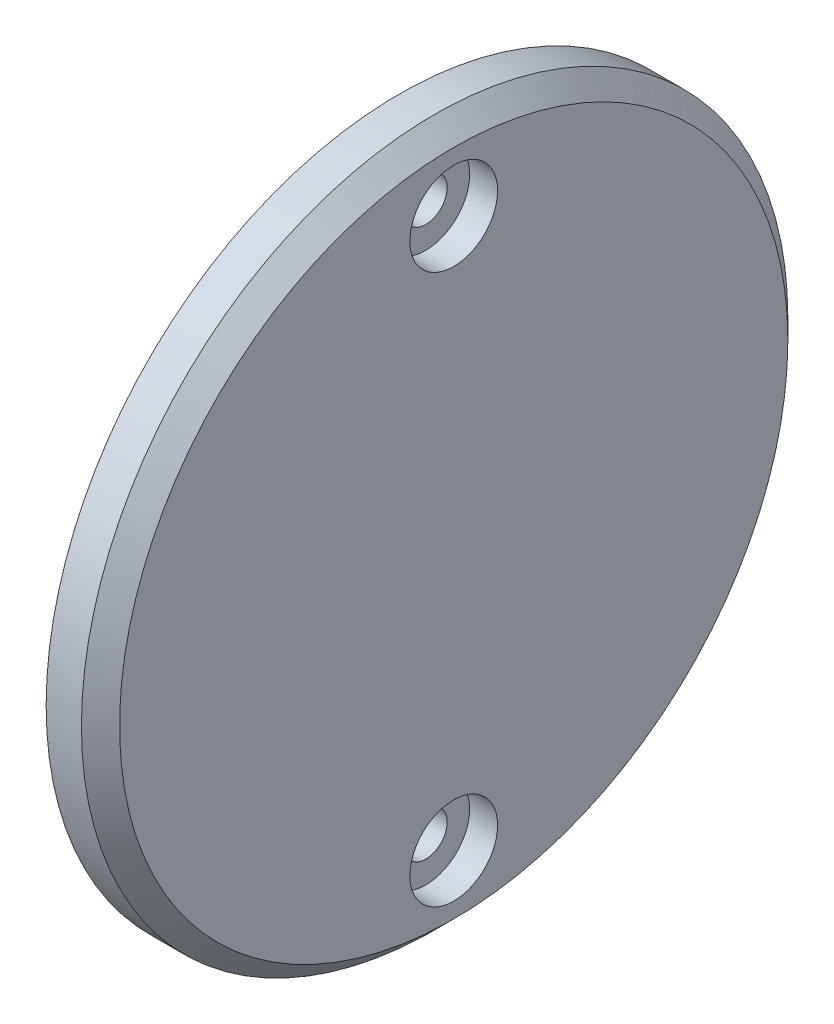
ISO-10303-21;
HEADER;
FILE_DESCRIPTION(('STEP AP214'),'2;1');
FILE_NAME('part.step','',(''),(''),'','','');
FILE_SCHEMA(('AUTOMOTIVE_DESIGN { 1 0 10303 214 1 1 1 1 }'));
ENDSEC;
DATA;
#1=APPLICATION_CONTEXT('core data for automotive mechanical design processes');
#2=APPLICATION_PROTOCOL_DEFINITION('international standard','automotive_design',2000,#1);
#3=PRODUCT_CONTEXT('',#1,'mechanical');
#4=PRODUCT('Part','Part','',(#3));
#5=PRODUCT_RELATED_PRODUCT_CATEGORY('part','',(#4));
#6=PRODUCT_DEFINITION_FORMATION('','',#4);
#7=PRODUCT_DEFINITION_CONTEXT('part definition',#1,'design');
#8=PRODUCT_DEFINITION('design','',#6,#7);
#9=PRODUCT_DEFINITION_SHAPE('','',#8);
#10=(LENGTH_UNIT() NAMED_UNIT(*) SI_UNIT(.MILLI.,.METRE.));
#11=(NAMED_UNIT(*) PLANE_ANGLE_UNIT() SI_UNIT($,.RADIAN.));
#12=(NAMED_UNIT(*) SI_UNIT($,.STERADIAN.) SOLID_ANGLE_UNIT());
#13=UNCERTAINTY_MEASURE_WITH_UNIT(LENGTH_MEASURE(1.E-05),#10,'distance_accuracy_value','');
#14=(GEOMETRIC_REPRESENTATION_CONTEXT(3) GLOBAL_UNCERTAINTY_ASSIGNED_CONTEXT((#13)) GLOBAL_UNIT_ASSIGNED_CONTEXT((#10,
#11,#12)) REPRESENTATION_CONTEXT('',''));
#15=CARTESIAN_POINT('',(0.,0.,0.));
#16=DIRECTION('',(0.,0.,1.));
#17=DIRECTION('',(1.,0.,0.));
#18=AXIS2_PLACEMENT_3D('',#15,#16,#17);
#19=CARTESIAN_POINT('',(8.55,0.,0.));
#20=DIRECTION('',(-1.,0.,0.));
#21=DIRECTION('',(0.,0.,1.));
#22=AXIS2_PLACEMENT_3D('',#19,#20,#21);
#23=CYLINDRICAL_SURFACE('',#22,55.5625);
#24=CARTESIAN_POINT('',(5.54999999999998,0.,0.));
#25=DIRECTION('',(1.,0.,0.));
#26=DIRECTION('',(0.,0.,-1.));
#27=AXIS2_PLACEMENT_3D('',#24,#25,#26);
#28=CIRCLE('',#27,55.5625);
#29=CARTESIAN_POINT('',(5.54999999999998,0.,-55.5625));
#30=VERTEX_POINT('',#29);
#31=EDGE_CURVE('E10',#30,#30,#28,.F.);
#32=ORIENTED_EDGE('',*,*,#31,.T.);
#33=EDGE_LOOP('',(#32));
#34=FACE_BOUND('',#33,.T.);
#35=CARTESIAN_POINT('',(0.,0.,0.));
#36=DIRECTION('',(1.,0.,0.));
#37=DIRECTION('',(0.,0.,-1.));
#38=AXIS2_PLACEMENT_3D('',#35,#36,#37);
#39=CIRCLE('',#38,55.5625);
#40=CARTESIAN_POINT('',(0.,0.,-55.5625));
#41=VERTEX_POINT('',#40);
#42=EDGE_CURVE('E51',#41,#41,#39,.T.);
#43=ORIENTED_EDGE('',*,*,#42,.T.);
#44=EDGE_LOOP('',(#43));
#45=FACE_BOUND('',#44,.T.);
#46=ADVANCED_FACE('F39',(#34,#45),#23,.T.);
#47=CARTESIAN_POINT('',(8.55,0.,0.));
#48=DIRECTION('',(1.,0.,0.));
#49=DIRECTION('',(0.,0.,-1.));
#50=AXIS2_PLACEMENT_3D('',#47,#48,#49);
#51=PLANE('',#50);
#52=CARTESIAN_POINT('',(8.55,-43.225,0.));
#53=DIRECTION('',(1.,0.,0.));
#54=DIRECTION('',(0.,0.,-1.));
#55=AXIS2_PLACEMENT_3D('',#52,#53,#54);
#56=CIRCLE('',#55,6.9);
#57=CARTESIAN_POINT('',(8.55,-43.225,-6.90000000000001));
#58=VERTEX_POINT('',#57);
#59=EDGE_CURVE('E65',#58,#58,#56,.T.);
#60=ORIENTED_EDGE('',*,*,#59,.F.);
#61=EDGE_LOOP('',(#60));
#62=FACE_BOUND('',#61,.T.);
#63=CARTESIAN_POINT('',(8.55,43.225,0.));
#64=DIRECTION('',(1.,0.,0.));
#65=DIRECTION('',(0.,0.,-1.));
#66=AXIS2_PLACEMENT_3D('',#63,#64,#65);
#67=CIRCLE('',#66,6.9);
#68=CARTESIAN_POINT('',(8.55,43.225,-6.9));
#69=VERTEX_POINT('',#68);
#70=EDGE_CURVE('E59',#69,#69,#67,.T.);
#71=ORIENTED_EDGE('',*,*,#70,.F.);
#72=EDGE_LOOP('',(#71));
#73=FACE_BOUND('',#72,.T.);
#74=CARTESIAN_POINT('',(8.55,0.,0.));
#75=DIRECTION('',(1.,0.,0.));
#76=DIRECTION('',(0.,0.,-1.));
#77=AXIS2_PLACEMENT_3D('',#74,#75,#76);
#78=CIRCLE('',#77,52.5625);
#79=CARTESIAN_POINT('',(8.55,0.,-52.5625));
#80=VERTEX_POINT('',#79);
#81=EDGE_CURVE('E50',#80,#80,#78,.T.);
#82=ORIENTED_EDGE('',*,*,#81,.T.);
#83=EDGE_LOOP('',(#82));
#84=FACE_BOUND('',#83,.T.);
#85=ADVANCED_FACE('F97',(#62,#73,#84),#51,.T.);
#86=CARTESIAN_POINT('',(0.,0.,0.));
#87=DIRECTION('',(1.,0.,0.));
#88=DIRECTION('',(0.,0.,-1.));
#89=AXIS2_PLACEMENT_3D('',#86,#87,#88);
#90=PLANE('',#89);
#91=CARTESIAN_POINT('',(0.,43.225,0.));
#92=DIRECTION('',(1.,0.,0.));
#93=DIRECTION('',(0.,0.,-1.));
#94=AXIS2_PLACEMENT_3D('',#91,#92,#93);
#95=CIRCLE('',#94,3.375);
#96=CARTESIAN_POINT('',(0.,43.225,-3.375));
#97=VERTEX_POINT('',#96);
#98=EDGE_CURVE('E62',#97,#97,#95,.F.);
#99=ORIENTED_EDGE('',*,*,#98,.F.);
#100=EDGE_LOOP('',(#99));
#101=FACE_BOUND('',#100,.T.);
#102=CARTESIAN_POINT('',(0.,-43.225,0.));
#103=DIRECTION('',(1.,0.,0.));
#104=DIRECTION('',(0.,0.,-1.));
#105=AXIS2_PLACEMENT_3D('',#102,#103,#104);
#106=CIRCLE('',#105,3.375);
#107=CARTESIAN_POINT('',(0.,-43.225,-3.37500000000001));
#108=VERTEX_POINT('',#107);
#109=EDGE_CURVE('E73',#108,#108,#106,.F.);
#110=ORIENTED_EDGE('',*,*,#109,.F.);
#111=EDGE_LOOP('',(#110));
#112=FACE_BOUND('',#111,.T.);
#113=ORIENTED_EDGE('',*,*,#42,.F.);
#114=EDGE_LOOP('',(#113));
#115=FACE_BOUND('',#114,.T.);
#116=ADVANCED_FACE('F100',(#101,#112,#115),#90,.F.);
#117=CARTESIAN_POINT('',(8.55,0.,0.));
#118=DIRECTION('',(-1.,0.,0.));
#119=DIRECTION('',(0.,0.,1.));
#120=AXIS2_PLACEMENT_3D('',#117,#118,#119);
#121=CONICAL_SURFACE('',#120,52.5625,0.785398163397445);
#122=ORIENTED_EDGE('',*,*,#31,.F.);
#123=EDGE_LOOP('',(#122));
#124=FACE_BOUND('',#123,.T.);
#125=ORIENTED_EDGE('',*,*,#81,.F.);
#126=EDGE_LOOP('',(#125));
#127=FACE_BOUND('',#126,.T.);
#128=ADVANCED_FACE('F45',(#124,#127),#121,.T.);
#129=CARTESIAN_POINT('',(4.15,43.225,0.));
#130=DIRECTION('',(1.,0.,0.));
#131=DIRECTION('',(0.,0.,-1.));
#132=AXIS2_PLACEMENT_3D('',#129,#130,#131);
#133=CYLINDRICAL_SURFACE('',#132,6.9);
#134=CARTESIAN_POINT('',(4.15,43.225,0.));
#135=DIRECTION('',(1.,0.,0.));
#136=DIRECTION('',(0.,0.,-1.));
#137=AXIS2_PLACEMENT_3D('',#134,#135,#136);
#138=CIRCLE('',#137,6.9);
#139=CARTESIAN_POINT('',(4.15,43.225,-6.9));
#140=VERTEX_POINT('',#139);
#141=EDGE_CURVE('E61',#140,#140,#138,.T.);
#142=ORIENTED_EDGE('',*,*,#141,.F.);
#143=EDGE_LOOP('',(#142));
#144=FACE_BOUND('',#143,.T.);
#145=ORIENTED_EDGE('',*,*,#70,.T.);
#146=EDGE_LOOP('',(#145));
#147=FACE_BOUND('',#146,.T.);
#148=ADVANCED_FACE('F87',(#144,#147),#133,.F.);
#149=CARTESIAN_POINT('',(4.15,0.,0.));
#150=DIRECTION('',(1.,0.,0.));
#151=DIRECTION('',(0.,0.,-1.));
#152=AXIS2_PLACEMENT_3D('',#149,#150,#151);
#153=PLANE('',#152);
#154=CARTESIAN_POINT('',(4.15,43.225,0.));
#155=DIRECTION('',(1.,0.,0.));
#156=DIRECTION('',(0.,0.,-1.));
#157=AXIS2_PLACEMENT_3D('',#154,#155,#156);
#158=CIRCLE('',#157,3.375);
#159=CARTESIAN_POINT('',(4.15,43.225,-3.375));
#160=VERTEX_POINT('',#159);
#161=EDGE_CURVE('E74',#160,#160,#158,.T.);
#162=ORIENTED_EDGE('',*,*,#161,.F.);
#163=EDGE_LOOP('',(#162));
#164=FACE_BOUND('',#163,.T.);
#165=ORIENTED_EDGE('',*,*,#141,.T.);
#166=EDGE_LOOP('',(#165));
#167=FACE_BOUND('',#166,.T.);
#168=ADVANCED_FACE('F83',(#164,#167),#153,.T.);
#169=CARTESIAN_POINT('',(4.15,-43.225,0.));
#170=DIRECTION('',(1.,0.,0.));
#171=DIRECTION('',(0.,0.,-1.));
#172=AXIS2_PLACEMENT_3D('',#169,#170,#171);
#173=CYLINDRICAL_SURFACE('',#172,6.9);
#174=CARTESIAN_POINT('',(4.15,-43.225,0.));
#175=DIRECTION('',(1.,0.,0.));
#176=DIRECTION('',(0.,0.,-1.));
#177=AXIS2_PLACEMENT_3D('',#174,#175,#176);
#178=CIRCLE('',#177,6.9);
#179=CARTESIAN_POINT('',(4.15,-43.225,-6.90000000000001));
#180=VERTEX_POINT('',#179);
#181=EDGE_CURVE('E54',#180,#180,#178,.T.);
#182=ORIENTED_EDGE('',*,*,#181,.F.);
#183=EDGE_LOOP('',(#182));
#184=FACE_BOUND('',#183,.T.);
#185=ORIENTED_EDGE('',*,*,#59,.T.);
#186=EDGE_LOOP('',(#185));
#187=FACE_BOUND('',#186,.T.);
#188=ADVANCED_FACE('F89',(#184,#187),#173,.F.);
#189=CARTESIAN_POINT('',(4.15,0.,0.));
#190=DIRECTION('',(1.,0.,0.));
#191=DIRECTION('',(0.,0.,-1.));
#192=AXIS2_PLACEMENT_3D('',#189,#190,#191);
#193=PLANE('',#192);
#194=CARTESIAN_POINT('',(4.15,-43.225,0.));
#195=DIRECTION('',(1.,0.,0.));
#196=DIRECTION('',(0.,0.,-1.));
#197=AXIS2_PLACEMENT_3D('',#194,#195,#196);
#198=CIRCLE('',#197,3.375);
#199=CARTESIAN_POINT('',(4.15,-43.225,-3.37500000000001));
#200=VERTEX_POINT('',#199);
#201=EDGE_CURVE('E66',#200,#200,#198,.T.);
#202=ORIENTED_EDGE('',*,*,#201,.F.);
#203=EDGE_LOOP('',(#202));
#204=FACE_BOUND('',#203,.T.);
#205=ORIENTED_EDGE('',*,*,#181,.T.);
#206=EDGE_LOOP('',(#205));
#207=FACE_BOUND('',#206,.T.);
#208=ADVANCED_FACE('F113',(#204,#207),#193,.T.);
#209=CARTESIAN_POINT('',(-9.5459415460184,-43.225,0.));
#210=DIRECTION('',(1.,0.,0.));
#211=DIRECTION('',(0.,0.,-1.));
#212=AXIS2_PLACEMENT_3D('',#209,#210,#211);
#213=CYLINDRICAL_SURFACE('',#212,3.375);
#214=CARTESIAN_POINT('',(0.,-43.225,-3.37500000000001));
#215=CARTESIAN_POINT('',(0.0432291666666648,-43.225,-3.37500000000001));
#216=CARTESIAN_POINT('',(0.0864583333333313,-43.225,-3.37500000000001));
#217=CARTESIAN_POINT('',(0.172916666666664,-43.225,-3.37500000000001));
#218=CARTESIAN_POINT('',(0.216145833333331,-43.225,-3.37500000000001));
#219=CARTESIAN_POINT('',(0.302604166666665,-43.225,-3.37500000000001));
#220=CARTESIAN_POINT('',(0.345833333333332,-43.225,-3.37500000000001));
#221=CARTESIAN_POINT('',(0.432291666666665,-43.225,-3.37500000000001));
#222=CARTESIAN_POINT('',(0.475520833333332,-43.225,-3.37500000000001));
#223=CARTESIAN_POINT('',(0.561979166666665,-43.225,-3.37500000000001));
#224=CARTESIAN_POINT('',(0.605208333333331,-43.225,-3.37500000000001));
#225=CARTESIAN_POINT('',(0.691666666666665,-43.225,-3.37500000000001));
#226=CARTESIAN_POINT('',(0.734895833333332,-43.225,-3.37500000000001));
#227=CARTESIAN_POINT('',(0.821354166666666,-43.225,-3.37500000000001));
#228=CARTESIAN_POINT('',(0.864583333333332,-43.225,-3.37500000000001));
#229=CARTESIAN_POINT('',(0.951041666666665,-43.225,-3.37500000000001));
#230=CARTESIAN_POINT('',(0.994270833333332,-43.225,-3.37500000000001));
#231=CARTESIAN_POINT('',(1.08072916666666,-43.225,-3.37500000000001));
#232=CARTESIAN_POINT('',(1.12395833333333,-43.225,-3.37500000000001));
#233=CARTESIAN_POINT('',(1.21041666666666,-43.225,-3.37500000000001));
#234=CARTESIAN_POINT('',(1.25364583333333,-43.225,-3.37500000000001));
#235=CARTESIAN_POINT('',(1.34010416666666,-43.225,-3.37500000000001));
#236=CARTESIAN_POINT('',(1.38333333333333,-43.225,-3.37500000000001));
#237=CARTESIAN_POINT('',(1.46979166666667,-43.225,-3.37500000000001));
#238=CARTESIAN_POINT('',(1.51302083333333,-43.225,-3.37500000000001));
#239=CARTESIAN_POINT('',(1.59947916666667,-43.225,-3.37500000000001));
#240=CARTESIAN_POINT('',(1.64270833333333,-43.225,-3.37500000000001));
#241=CARTESIAN_POINT('',(1.72916666666667,-43.225,-3.37500000000001));
#242=CARTESIAN_POINT('',(1.77239583333333,-43.225,-3.37500000000001));
#243=CARTESIAN_POINT('',(1.85885416666667,-43.225,-3.37500000000001));
#244=CARTESIAN_POINT('',(1.90208333333333,-43.225,-3.37500000000001));
#245=CARTESIAN_POINT('',(1.98854166666667,-43.225,-3.37500000000001));
#246=CARTESIAN_POINT('',(2.03177083333333,-43.225,-3.37500000000001));
#247=CARTESIAN_POINT('',(2.11822916666667,-43.225,-3.37500000000001));
#248=CARTESIAN_POINT('',(2.16145833333333,-43.225,-3.37500000000001));
#249=CARTESIAN_POINT('',(2.24791666666667,-43.225,-3.37500000000001));
#250=CARTESIAN_POINT('',(2.29114583333333,-43.225,-3.37500000000001));
#251=CARTESIAN_POINT('',(2.37760416666667,-43.225,-3.37500000000001));
#252=CARTESIAN_POINT('',(2.42083333333333,-43.225,-3.37500000000001));
#253=CARTESIAN_POINT('',(2.50729166666667,-43.225,-3.37500000000001));
#254=CARTESIAN_POINT('',(2.55052083333333,-43.225,-3.37500000000001));
#255=CARTESIAN_POINT('',(2.63697916666667,-43.225,-3.37500000000001));
#256=CARTESIAN_POINT('',(2.68020833333333,-43.225,-3.37500000000001));
#257=CARTESIAN_POINT('',(2.76666666666667,-43.225,-3.37500000000001));
#258=CARTESIAN_POINT('',(2.80989583333333,-43.225,-3.37500000000001));
#259=CARTESIAN_POINT('',(2.89635416666667,-43.225,-3.37500000000001));
#260=CARTESIAN_POINT('',(2.93958333333333,-43.225,-3.37500000000001));
#261=CARTESIAN_POINT('',(3.02604166666667,-43.225,-3.37500000000001));
#262=CARTESIAN_POINT('',(3.06927083333333,-43.225,-3.37500000000001));
#263=CARTESIAN_POINT('',(3.15572916666667,-43.225,-3.37500000000001));
#264=CARTESIAN_POINT('',(3.19895833333333,-43.225,-3.37500000000001));
#265=CARTESIAN_POINT('',(3.28541666666667,-43.225,-3.37500000000001));
#266=CARTESIAN_POINT('',(3.32864583333333,-43.225,-3.37500000000001));
#267=CARTESIAN_POINT('',(3.41510416666667,-43.225,-3.37500000000001));
#268=CARTESIAN_POINT('',(3.45833333333333,-43.225,-3.37500000000001));
#269=CARTESIAN_POINT('',(3.54479166666667,-43.225,-3.37500000000001));
#270=CARTESIAN_POINT('',(3.58802083333333,-43.225,-3.37500000000001));
#271=CARTESIAN_POINT('',(3.67447916666667,-43.225,-3.37500000000001));
#272=CARTESIAN_POINT('',(3.71770833333333,-43.225,-3.37500000000001));
#273=CARTESIAN_POINT('',(3.80416666666667,-43.225,-3.37500000000001));
#274=CARTESIAN_POINT('',(3.84739583333333,-43.225,-3.37500000000001));
#275=CARTESIAN_POINT('',(3.93385416666667,-43.225,-3.37500000000001));
#276=CARTESIAN_POINT('',(3.97708333333333,-43.225,-3.37500000000001));
#277=CARTESIAN_POINT('',(4.06354166666667,-43.225,-3.37500000000001));
#278=CARTESIAN_POINT('',(4.10677083333333,-43.225,-3.37500000000001));
#279=CARTESIAN_POINT('',(4.15,-43.225,-3.37500000000001));
#280=B_SPLINE_CURVE_WITH_KNOTS('',3,(#214,#215,#216,#217,#218,#219,#220,#221,#222,#223,#224,
#225,#226,#227,#228,#229,#230,#231,#232,#233,#234,#235,#236,#237,#238,#239,#240,#241,#242,#243,
#244,#245,#246,#247,#248,#249,#250,#251,#252,#253,#254,#255,#256,#257,#258,#259,#260,#261,#262,
#263,#264,#265,#266,#267,#268,#269,#270,#271,#272,#273,#274,#275,#276,#277,#278,#279),
.UNSPECIFIED.,.F.,.F.,(4,2,2,2,2,2,2,2,2,2,2,2,2,2,2,2,2,2,2,2,2,2,2,2,2,2,2,2,2,2,2,2,4),(0.,
0.1296875,0.259374999999999,0.389062500000001,0.51875,0.6484375,0.778125000000001,
0.907812500000001,1.0375,1.1671875,1.296875,1.4265625,1.55625,1.6859375,1.815625,1.9453125,
2.075,2.2046875,2.334375,2.4640625,2.59375,2.7234375,2.853125,2.9828125,3.1125,3.2421875,
3.371875,3.5015625,3.63125,3.7609375,3.890625,4.0203125,4.15),.UNSPECIFIED.);
#281=EDGE_CURVE('BSEAM120',#108,#200,#280,.T.);
#282=ORIENTED_EDGE('',*,*,#109,.T.);
#283=ORIENTED_EDGE('',*,*,#201,.T.);
#284=ORIENTED_EDGE('',*,*,#281,.T.);
#285=ORIENTED_EDGE('',*,*,#281,.F.);
#286=EDGE_LOOP('',(#282,#284,#283,#285));
#287=FACE_BOUND('',#286,.T.);
#288=ADVANCED_FACE('F120',(#287),#213,.F.);
#289=CARTESIAN_POINT('',(-9.5459415460184,43.225,0.));
#290=DIRECTION('',(1.,0.,0.));
#291=DIRECTION('',(0.,0.,-1.));
#292=AXIS2_PLACEMENT_3D('',#289,#290,#291);
#293=CYLINDRICAL_SURFACE('',#292,3.375);
#294=CARTESIAN_POINT('',(0.,43.225,-3.375));
#295=CARTESIAN_POINT('',(0.0432291666666648,43.225,-3.375));
#296=CARTESIAN_POINT('',(0.0864583333333313,43.225,-3.375));
#297=CARTESIAN_POINT('',(0.172916666666664,43.225,-3.375));
#298=CARTESIAN_POINT('',(0.216145833333331,43.225,-3.375));
#299=CARTESIAN_POINT('',(0.302604166666665,43.225,-3.375));
#300=CARTESIAN_POINT('',(0.345833333333332,43.225,-3.375));
#301=CARTESIAN_POINT('',(0.432291666666665,43.225,-3.375));
#302=CARTESIAN_POINT('',(0.475520833333332,43.225,-3.375));
#303=CARTESIAN_POINT('',(0.561979166666665,43.225,-3.375));
#304=CARTESIAN_POINT('',(0.605208333333331,43.225,-3.375));
#305=CARTESIAN_POINT('',(0.691666666666665,43.225,-3.375));
#306=CARTESIAN_POINT('',(0.734895833333332,43.225,-3.375));
#307=CARTESIAN_POINT('',(0.821354166666666,43.225,-3.375));
#308=CARTESIAN_POINT('',(0.864583333333332,43.225,-3.375));
#309=CARTESIAN_POINT('',(0.951041666666665,43.225,-3.375));
#310=CARTESIAN_POINT('',(0.994270833333332,43.225,-3.375));
#311=CARTESIAN_POINT('',(1.08072916666666,43.225,-3.375));
#312=CARTESIAN_POINT('',(1.12395833333333,43.225,-3.375));
#313=CARTESIAN_POINT('',(1.21041666666666,43.225,-3.375));
#314=CARTESIAN_POINT('',(1.25364583333333,43.225,-3.375));
#315=CARTESIAN_POINT('',(1.34010416666666,43.225,-3.375));
#316=CARTESIAN_POINT('',(1.38333333333333,43.225,-3.375));
#317=CARTESIAN_POINT('',(1.46979166666667,43.225,-3.375));
#318=CARTESIAN_POINT('',(1.51302083333333,43.225,-3.375));
#319=CARTESIAN_POINT('',(1.59947916666667,43.225,-3.375));
#320=CARTESIAN_POINT('',(1.64270833333333,43.225,-3.375));
#321=CARTESIAN_POINT('',(1.72916666666667,43.225,-3.375));
#322=CARTESIAN_POINT('',(1.77239583333333,43.225,-3.375));
#323=CARTESIAN_POINT('',(1.85885416666667,43.225,-3.375));
#324=CARTESIAN_POINT('',(1.90208333333333,43.225,-3.375));
#325=CARTESIAN_POINT('',(1.98854166666667,43.225,-3.375));
#326=CARTESIAN_POINT('',(2.03177083333333,43.225,-3.375));
#327=CARTESIAN_POINT('',(2.11822916666667,43.225,-3.375));
#328=CARTESIAN_POINT('',(2.16145833333333,43.225,-3.375));
#329=CARTESIAN_POINT('',(2.24791666666667,43.225,-3.375));
#330=CARTESIAN_POINT('',(2.29114583333333,43.225,-3.375));
#331=CARTESIAN_POINT('',(2.37760416666667,43.225,-3.375));
#332=CARTESIAN_POINT('',(2.42083333333333,43.225,-3.375));
#333=CARTESIAN_POINT('',(2.50729166666667,43.225,-3.375));
#334=CARTESIAN_POINT('',(2.55052083333333,43.225,-3.375));
#335=CARTESIAN_POINT('',(2.63697916666667,43.225,-3.375));
#336=CARTESIAN_POINT('',(2.68020833333333,43.225,-3.375));
#337=CARTESIAN_POINT('',(2.76666666666667,43.225,-3.375));
#338=CARTESIAN_POINT('',(2.80989583333333,43.225,-3.375));
#339=CARTESIAN_POINT('',(2.89635416666667,43.225,-3.375));
#340=CARTESIAN_POINT('',(2.93958333333333,43.225,-3.375));
#341=CARTESIAN_POINT('',(3.02604166666667,43.225,-3.375));
#342=CARTESIAN_POINT('',(3.06927083333333,43.225,-3.375));
#343=CARTESIAN_POINT('',(3.15572916666667,43.225,-3.375));
#344=CARTESIAN_POINT('',(3.19895833333333,43.225,-3.375));
#345=CARTESIAN_POINT('',(3.28541666666667,43.225,-3.375));
#346=CARTESIAN_POINT('',(3.32864583333333,43.225,-3.375));
#347=CARTESIAN_POINT('',(3.41510416666667,43.225,-3.375));
#348=CARTESIAN_POINT('',(3.45833333333333,43.225,-3.375));
#349=CARTESIAN_POINT('',(3.54479166666667,43.225,-3.375));
#350=CARTESIAN_POINT('',(3.58802083333333,43.225,-3.375));
#351=CARTESIAN_POINT('',(3.67447916666667,43.225,-3.375));
#352=CARTESIAN_POINT('',(3.71770833333333,43.225,-3.375));
#353=CARTESIAN_POINT('',(3.80416666666667,43.225,-3.375));
#354=CARTESIAN_POINT('',(3.84739583333333,43.225,-3.375));
#355=CARTESIAN_POINT('',(3.93385416666667,43.225,-3.375));
#356=CARTESIAN_POINT('',(3.97708333333333,43.225,-3.375));
#357=CARTESIAN_POINT('',(4.06354166666667,43.225,-3.375));
#358=CARTESIAN_POINT('',(4.10677083333333,43.225,-3.375));
#359=CARTESIAN_POINT('',(4.15,43.225,-3.375));
#360=B_SPLINE_CURVE_WITH_KNOTS('',3,(#294,#295,#296,#297,#298,#299,#300,#301,#302,#303,#304,
#305,#306,#307,#308,#309,#310,#311,#312,#313,#314,#315,#316,#317,#318,#319,#320,#321,#322,#323,
#324,#325,#326,#327,#328,#329,#330,#331,#332,#333,#334,#335,#336,#337,#338,#339,#340,#341,#342,
#343,#344,#345,#346,#347,#348,#349,#350,#351,#352,#353,#354,#355,#356,#357,#358,#359),
.UNSPECIFIED.,.F.,.F.,(4,2,2,2,2,2,2,2,2,2,2,2,2,2,2,2,2,2,2,2,2,2,2,2,2,2,2,2,2,2,2,2,4),(0.,
0.1296875,0.259374999999999,0.389062500000001,0.51875,0.6484375,0.778125000000001,
0.907812500000001,1.0375,1.1671875,1.296875,1.4265625,1.55625,1.6859375,1.815625,1.9453125,
2.075,2.2046875,2.334375,2.4640625,2.59375,2.7234375,2.853125,2.9828125,3.1125,3.2421875,
3.371875,3.5015625,3.63125,3.7609375,3.890625,4.0203125,4.15),.UNSPECIFIED.);
#361=EDGE_CURVE('BSEAM82',#97,#160,#360,.T.);
#362=ORIENTED_EDGE('',*,*,#98,.T.);
#363=ORIENTED_EDGE('',*,*,#161,.T.);
#364=ORIENTED_EDGE('',*,*,#361,.T.);
#365=ORIENTED_EDGE('',*,*,#361,.F.);
#366=EDGE_LOOP('',(#362,#364,#363,#365));
#367=FACE_BOUND('',#366,.T.);
#368=ADVANCED_FACE('F82',(#367),#293,.F.);
#369=CLOSED_SHELL('',(#46,#85,#116,#128,#148,#168,#188,#208,#288,#368));
#370=MANIFOLD_SOLID_BREP('B2',#369);
#371=ADVANCED_BREP_SHAPE_REPRESENTATION('',(#18,#370),#14);
#372=SHAPE_DEFINITION_REPRESENTATION(#9,#371);
ENDSEC;
END-ISO-10303-21;
